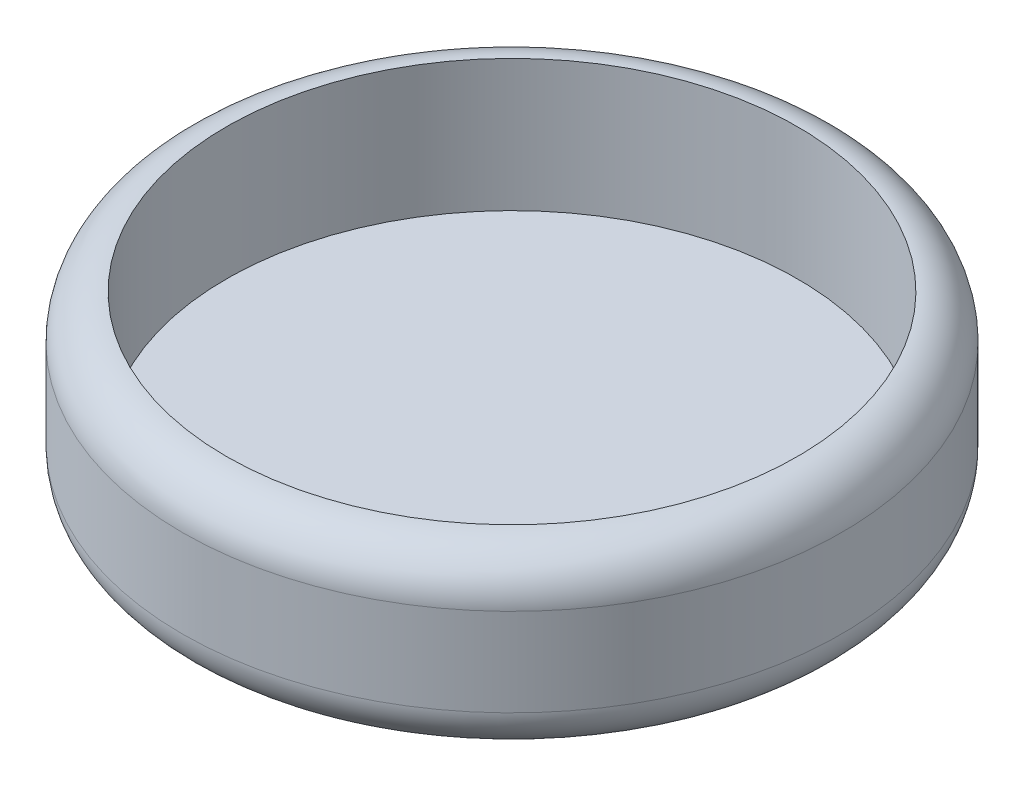
ISO-10303-21;
HEADER;
FILE_DESCRIPTION(('STEP AP214'),'2;1');
FILE_NAME('part.step','',(''),(''),'','','');
FILE_SCHEMA(('AUTOMOTIVE_DESIGN { 1 0 10303 214 1 1 1 1 }'));
ENDSEC;
DATA;
#1=APPLICATION_CONTEXT('core data for automotive mechanical design processes');
#2=APPLICATION_PROTOCOL_DEFINITION('international standard','automotive_design',2000,#1);
#3=PRODUCT_CONTEXT('',#1,'mechanical');
#4=PRODUCT('Part','Part','',(#3));
#5=PRODUCT_RELATED_PRODUCT_CATEGORY('part','',(#4));
#6=PRODUCT_DEFINITION_FORMATION('','',#4);
#7=PRODUCT_DEFINITION_CONTEXT('part definition',#1,'design');
#8=PRODUCT_DEFINITION('design','',#6,#7);
#9=PRODUCT_DEFINITION_SHAPE('','',#8);
#10=(LENGTH_UNIT() NAMED_UNIT(*) SI_UNIT(.MILLI.,.METRE.));
#11=(NAMED_UNIT(*) PLANE_ANGLE_UNIT() SI_UNIT($,.RADIAN.));
#12=(NAMED_UNIT(*) SI_UNIT($,.STERADIAN.) SOLID_ANGLE_UNIT());
#13=UNCERTAINTY_MEASURE_WITH_UNIT(LENGTH_MEASURE(1.E-05),#10,'distance_accuracy_value','');
#14=(GEOMETRIC_REPRESENTATION_CONTEXT(3) GLOBAL_UNCERTAINTY_ASSIGNED_CONTEXT((#13)) GLOBAL_UNIT_ASSIGNED_CONTEXT((#10,
#11,#12)) REPRESENTATION_CONTEXT('',''));
#15=CARTESIAN_POINT('',(0.,0.,0.));
#16=DIRECTION('',(0.,0.,1.));
#17=DIRECTION('',(1.,0.,0.));
#18=AXIS2_PLACEMENT_3D('',#15,#16,#17);
#19=CARTESIAN_POINT('',(0.,3.,0.));
#20=DIRECTION('',(0.,1.,0.));
#21=DIRECTION('',(0.,0.,1.));
#22=AXIS2_PLACEMENT_3D('',#19,#20,#21);
#23=TOROIDAL_SURFACE('',#22,6.5,1.);
#24=CARTESIAN_POINT('',(0.,4.,0.));
#25=DIRECTION('',(0.,1.,0.));
#26=DIRECTION('',(0.,0.,1.));
#27=AXIS2_PLACEMENT_3D('',#24,#25,#26);
#28=CIRCLE('',#27,6.5);
#29=CARTESIAN_POINT('',(0.,4.,6.5));
#30=VERTEX_POINT('',#29);
#31=EDGE_CURVE('E62',#30,#30,#28,.T.);
#32=ORIENTED_EDGE('',*,*,#31,.F.);
#33=EDGE_LOOP('',(#32));
#34=FACE_BOUND('',#33,.T.);
#35=CARTESIAN_POINT('',(0.,3.,0.));
#36=DIRECTION('',(0.,1.,0.));
#37=DIRECTION('',(0.,0.,1.));
#38=AXIS2_PLACEMENT_3D('',#35,#36,#37);
#39=CIRCLE('',#38,7.5);
#40=CARTESIAN_POINT('',(0.,3.,7.5));
#41=VERTEX_POINT('',#40);
#42=EDGE_CURVE('E54',#41,#41,#39,.F.);
#43=ORIENTED_EDGE('',*,*,#42,.F.);
#44=EDGE_LOOP('',(#43));
#45=FACE_BOUND('',#44,.T.);
#46=ADVANCED_FACE('F41',(#34,#45),#23,.T.);
#47=CARTESIAN_POINT('',(0.,4.,0.));
#48=DIRECTION('',(0.,-1.,0.));
#49=DIRECTION('',(0.,0.,-1.));
#50=AXIS2_PLACEMENT_3D('',#47,#48,#49);
#51=CYLINDRICAL_SURFACE('',#50,7.5);
#52=CARTESIAN_POINT('',(0.,1.,0.));
#53=DIRECTION('',(0.,1.,0.));
#54=DIRECTION('',(0.,0.,1.));
#55=AXIS2_PLACEMENT_3D('',#52,#53,#54);
#56=CIRCLE('',#55,7.5);
#57=CARTESIAN_POINT('',(0.,1.,7.5));
#58=VERTEX_POINT('',#57);
#59=EDGE_CURVE('E49',#58,#58,#56,.T.);
#60=ORIENTED_EDGE('',*,*,#59,.T.);
#61=EDGE_LOOP('',(#60));
#62=FACE_BOUND('',#61,.T.);
#63=ORIENTED_EDGE('',*,*,#42,.T.);
#64=EDGE_LOOP('',(#63));
#65=FACE_BOUND('',#64,.T.);
#66=ADVANCED_FACE('F81',(#62,#65),#51,.T.);
#67=CARTESIAN_POINT('',(0.,0.,0.));
#68=DIRECTION('',(0.,1.,0.));
#69=DIRECTION('',(0.,0.,1.));
#70=AXIS2_PLACEMENT_3D('',#67,#68,#69);
#71=PLANE('',#70);
#72=CARTESIAN_POINT('',(0.,0.,0.));
#73=DIRECTION('',(0.,1.,0.));
#74=DIRECTION('',(0.,0.,1.));
#75=AXIS2_PLACEMENT_3D('',#72,#73,#74);
#76=CIRCLE('',#75,6.5);
#77=CARTESIAN_POINT('',(0.,0.,6.5));
#78=VERTEX_POINT('',#77);
#79=EDGE_CURVE('E10',#78,#78,#76,.F.);
#80=ORIENTED_EDGE('',*,*,#79,.T.);
#81=EDGE_LOOP('',(#80));
#82=FACE_BOUND('',#81,.T.);
#83=ADVANCED_FACE('F75',(#82),#71,.F.);
#84=CARTESIAN_POINT('',(0.,1.,0.));
#85=DIRECTION('',(0.,1.,0.));
#86=DIRECTION('',(0.,0.,1.));
#87=AXIS2_PLACEMENT_3D('',#84,#85,#86);
#88=CYLINDRICAL_SURFACE('',#87,6.5);
#89=CARTESIAN_POINT('',(0.,1.,0.));
#90=DIRECTION('',(0.,1.,0.));
#91=DIRECTION('',(0.,0.,1.));
#92=AXIS2_PLACEMENT_3D('',#89,#90,#91);
#93=CIRCLE('',#92,6.5);
#94=CARTESIAN_POINT('',(0.,1.,6.5));
#95=VERTEX_POINT('',#94);
#96=EDGE_CURVE('E59',#95,#95,#93,.T.);
#97=ORIENTED_EDGE('',*,*,#96,.F.);
#98=EDGE_LOOP('',(#97));
#99=FACE_BOUND('',#98,.T.);
#100=ORIENTED_EDGE('',*,*,#31,.T.);
#101=EDGE_LOOP('',(#100));
#102=FACE_BOUND('',#101,.T.);
#103=ADVANCED_FACE('F72',(#99,#102),#88,.F.);
#104=CARTESIAN_POINT('',(0.,1.,0.));
#105=DIRECTION('',(0.,1.,0.));
#106=DIRECTION('',(0.,0.,1.));
#107=AXIS2_PLACEMENT_3D('',#104,#105,#106);
#108=PLANE('',#107);
#109=ORIENTED_EDGE('',*,*,#96,.T.);
#110=EDGE_LOOP('',(#109));
#111=FACE_BOUND('',#110,.T.);
#112=ADVANCED_FACE('F70',(#111),#108,.T.);
#113=CARTESIAN_POINT('',(0.,1.,0.));
#114=DIRECTION('',(0.,1.,0.));
#115=DIRECTION('',(0.,0.,1.));
#116=AXIS2_PLACEMENT_3D('',#113,#114,#115);
#117=TOROIDAL_SURFACE('',#116,6.5,1.);
#118=ORIENTED_EDGE('',*,*,#79,.F.);
#119=EDGE_LOOP('',(#118));
#120=FACE_BOUND('',#119,.T.);
#121=ORIENTED_EDGE('',*,*,#59,.F.);
#122=EDGE_LOOP('',(#121));
#123=FACE_BOUND('',#122,.T.);
#124=ADVANCED_FACE('F43',(#120,#123),#117,.T.);
#125=CLOSED_SHELL('',(#46,#66,#83,#103,#112,#124));
#126=MANIFOLD_SOLID_BREP('B2',#125);
#127=ADVANCED_BREP_SHAPE_REPRESENTATION('',(#18,#126),#14);
#128=SHAPE_DEFINITION_REPRESENTATION(#9,#127);
ENDSEC;
END-ISO-10303-21;
